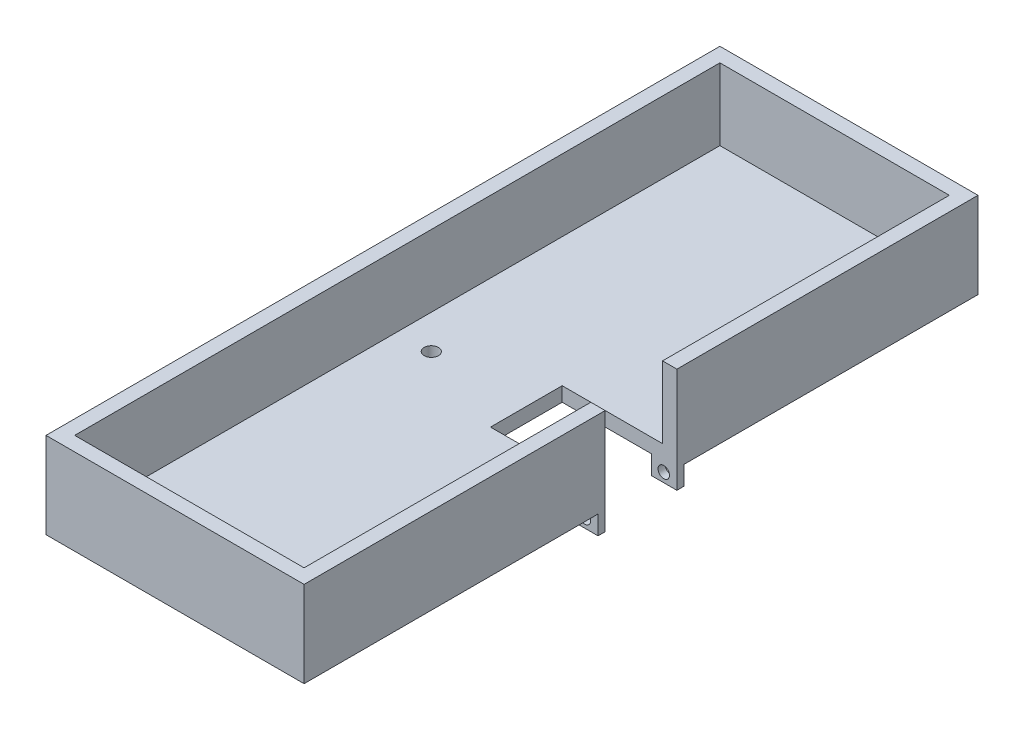
ISO-10303-21;
HEADER;
FILE_DESCRIPTION(('STEP AP214'),'2;1');
FILE_NAME('part.step','',(''),(''),'','','');
FILE_SCHEMA(('AUTOMOTIVE_DESIGN { 1 0 10303 214 1 1 1 1 }'));
ENDSEC;
DATA;
#1=APPLICATION_CONTEXT('core data for automotive mechanical design processes');
#2=APPLICATION_PROTOCOL_DEFINITION('international standard','automotive_design',2000,#1);
#3=PRODUCT_CONTEXT('',#1,'mechanical');
#4=PRODUCT('Part','Part','',(#3));
#5=PRODUCT_RELATED_PRODUCT_CATEGORY('part','',(#4));
#6=PRODUCT_DEFINITION_FORMATION('','',#4);
#7=PRODUCT_DEFINITION_CONTEXT('part definition',#1,'design');
#8=PRODUCT_DEFINITION('design','',#6,#7);
#9=PRODUCT_DEFINITION_SHAPE('','',#8);
#10=(LENGTH_UNIT() NAMED_UNIT(*) SI_UNIT(.MILLI.,.METRE.));
#11=(NAMED_UNIT(*) PLANE_ANGLE_UNIT() SI_UNIT($,.RADIAN.));
#12=(NAMED_UNIT(*) SI_UNIT($,.STERADIAN.) SOLID_ANGLE_UNIT());
#13=UNCERTAINTY_MEASURE_WITH_UNIT(LENGTH_MEASURE(1.E-05),#10,'distance_accuracy_value','');
#14=(GEOMETRIC_REPRESENTATION_CONTEXT(3) GLOBAL_UNCERTAINTY_ASSIGNED_CONTEXT((#13)) GLOBAL_UNIT_ASSIGNED_CONTEXT((#10,
#11,#12)) REPRESENTATION_CONTEXT('',''));
#15=CARTESIAN_POINT('',(0.,0.,0.));
#16=DIRECTION('',(0.,0.,1.));
#17=DIRECTION('',(1.,0.,0.));
#18=AXIS2_PLACEMENT_3D('',#15,#16,#17);
#19=CARTESIAN_POINT('',(0.,-60.,470.));
#20=DIRECTION('',(0.,1.,0.));
#21=DIRECTION('',(0.,0.,1.));
#22=AXIS2_PLACEMENT_3D('',#19,#20,#21);
#23=PLANE('',#22);
#24=CARTESIAN_POINT('',(33.75,-60.,235.));
#25=DIRECTION('',(0.,1.,0.));
#26=DIRECTION('',(0.,0.,1.));
#27=AXIS2_PLACEMENT_3D('',#24,#25,#26);
#28=CIRCLE('',#27,5.00000000000001);
#29=CARTESIAN_POINT('',(33.75,-60.,240.));
#30=VERTEX_POINT('',#29);
#31=EDGE_CURVE('E335',#30,#30,#28,.T.);
#32=ORIENTED_EDGE('',*,*,#31,.T.);
#33=EDGE_LOOP('',(#32));
#34=FACE_BOUND('',#33,.T.);
#35=DIRECTION('',(-1.,0.,0.));
#36=VECTOR('',#35,1.);
#37=CARTESIAN_POINT('',(162.3437837944,-60.,265.));
#38=LINE('',#37,#36);
#39=CARTESIAN_POINT('',(180.,-60.,265.));
#40=VERTEX_POINT('',#39);
#41=CARTESIAN_POINT('',(162.3437837944,-60.,265.));
#42=VERTEX_POINT('',#41);
#43=EDGE_CURVE('E56',#40,#42,#38,.T.);
#44=ORIENTED_EDGE('',*,*,#43,.F.);
#45=DIRECTION('',(0.,0.,-1.));
#46=VECTOR('',#45,1.);
#47=CARTESIAN_POINT('',(180.,-60.,470.));
#48=LINE('',#47,#46);
#49=CARTESIAN_POINT('',(180.,-60.,470.));
#50=VERTEX_POINT('',#49);
#51=EDGE_CURVE('E195',#50,#40,#48,.T.);
#52=ORIENTED_EDGE('',*,*,#51,.F.);
#53=DIRECTION('',(1.,0.,0.));
#54=VECTOR('',#53,1.);
#55=CARTESIAN_POINT('',(0.,-60.,470.));
#56=LINE('',#55,#54);
#57=CARTESIAN_POINT('',(0.,-60.,470.));
#58=VERTEX_POINT('',#57);
#59=EDGE_CURVE('E279',#58,#50,#56,.T.);
#60=ORIENTED_EDGE('',*,*,#59,.F.);
#61=DIRECTION('',(0.,0.,-1.));
#62=VECTOR('',#61,1.);
#63=CARTESIAN_POINT('',(0.,-60.,470.));
#64=LINE('',#63,#62);
#65=CARTESIAN_POINT('',(0.,-60.,0.));
#66=VERTEX_POINT('',#65);
#67=EDGE_CURVE('E283',#58,#66,#64,.T.);
#68=ORIENTED_EDGE('',*,*,#67,.T.);
#69=DIRECTION('',(1.,0.,0.));
#70=VECTOR('',#69,1.);
#71=CARTESIAN_POINT('',(0.,-60.,0.));
#72=LINE('',#71,#70);
#73=CARTESIAN_POINT('',(180.,-60.,0.));
#74=VERTEX_POINT('',#73);
#75=EDGE_CURVE('E284',#66,#74,#72,.T.);
#76=ORIENTED_EDGE('',*,*,#75,.T.);
#77=CARTESIAN_POINT('',(180.,-60.,205.));
#78=VERTEX_POINT('',#77);
#79=EDGE_CURVE('E277',#78,#74,#48,.T.);
#80=ORIENTED_EDGE('',*,*,#79,.F.);
#81=DIRECTION('',(-1.,0.,0.));
#82=VECTOR('',#81,1.);
#83=CARTESIAN_POINT('',(162.3437837944,-60.,205.));
#84=LINE('',#83,#82);
#85=CARTESIAN_POINT('',(162.3437837944,-60.,205.));
#86=VERTEX_POINT('',#85);
#87=EDGE_CURVE('E237',#78,#86,#84,.T.);
#88=ORIENTED_EDGE('',*,*,#87,.T.);
#89=DIRECTION('',(0.,0.,1.));
#90=VECTOR('',#89,1.);
#91=CARTESIAN_POINT('',(162.3437837944,-60.,205.));
#92=LINE('',#91,#90);
#93=CARTESIAN_POINT('',(162.3437837944,-60.,210.));
#94=VERTEX_POINT('',#93);
#95=EDGE_CURVE('E229',#86,#94,#92,.T.);
#96=ORIENTED_EDGE('',*,*,#95,.T.);
#97=DIRECTION('',(1.,0.,0.));
#98=VECTOR('',#97,1.);
#99=CARTESIAN_POINT('',(0.,-60.,210.));
#100=LINE('',#99,#98);
#101=CARTESIAN_POINT('',(100.,-60.,210.));
#102=VERTEX_POINT('',#101);
#103=EDGE_CURVE('E268',#102,#94,#100,.T.);
#104=ORIENTED_EDGE('',*,*,#103,.F.);
#105=DIRECTION('',(0.,0.,1.));
#106=VECTOR('',#105,1.);
#107=CARTESIAN_POINT('',(100.,-60.,470.));
#108=LINE('',#107,#106);
#109=CARTESIAN_POINT('',(100.,-60.,260.));
#110=VERTEX_POINT('',#109);
#111=EDGE_CURVE('E11',#102,#110,#108,.T.);
#112=ORIENTED_EDGE('',*,*,#111,.T.);
#113=DIRECTION('',(1.,0.,0.));
#114=VECTOR('',#113,1.);
#115=CARTESIAN_POINT('',(0.,-60.,260.));
#116=LINE('',#115,#114);
#117=CARTESIAN_POINT('',(162.3437837944,-60.,260.));
#118=VERTEX_POINT('',#117);
#119=EDGE_CURVE('E260',#110,#118,#116,.T.);
#120=ORIENTED_EDGE('',*,*,#119,.T.);
#121=DIRECTION('',(0.,0.,-1.));
#122=VECTOR('',#121,1.);
#123=CARTESIAN_POINT('',(162.3437837944,-60.,265.));
#124=LINE('',#123,#122);
#125=EDGE_CURVE('E52',#42,#118,#124,.T.);
#126=ORIENTED_EDGE('',*,*,#125,.F.);
#127=EDGE_LOOP('',(#44,#52,#60,#68,#76,#80,#88,#96,#104,#112,#120,#126));
#128=FACE_BOUND('',#127,.T.);
#129=ADVANCED_FACE('F35',(#34,#128),#23,.F.);
#130=CARTESIAN_POINT('',(0.,-50.,470.));
#131=DIRECTION('',(0.,1.,0.));
#132=DIRECTION('',(0.,0.,1.));
#133=AXIS2_PLACEMENT_3D('',#130,#131,#132);
#134=PLANE('',#133);
#135=CARTESIAN_POINT('',(33.75,-50.,235.));
#136=DIRECTION('',(0.,1.,0.));
#137=DIRECTION('',(0.,0.,1.));
#138=AXIS2_PLACEMENT_3D('',#135,#136,#137);
#139=CIRCLE('',#138,5.00000000000001);
#140=CARTESIAN_POINT('',(33.75,-50.,240.));
#141=VERTEX_POINT('',#140);
#142=EDGE_CURVE('E339',#141,#141,#139,.T.);
#143=ORIENTED_EDGE('',*,*,#142,.F.);
#144=EDGE_LOOP('',(#143));
#145=FACE_BOUND('',#144,.T.);
#146=DIRECTION('',(0.,0.,1.));
#147=VECTOR('',#146,1.);
#148=CARTESIAN_POINT('',(100.,-50.,470.));
#149=LINE('',#148,#147);
#150=CARTESIAN_POINT('',(100.,-50.,210.));
#151=VERTEX_POINT('',#150);
#152=CARTESIAN_POINT('',(100.,-50.,260.));
#153=VERTEX_POINT('',#152);
#154=EDGE_CURVE('E271',#151,#153,#149,.T.);
#155=ORIENTED_EDGE('',*,*,#154,.F.);
#156=DIRECTION('',(1.,0.,0.));
#157=VECTOR('',#156,1.);
#158=CARTESIAN_POINT('',(0.,-50.,210.));
#159=LINE('',#158,#157);
#160=CARTESIAN_POINT('',(170.,-50.,210.));
#161=VERTEX_POINT('',#160);
#162=EDGE_CURVE('E265',#151,#161,#159,.T.);
#163=ORIENTED_EDGE('',*,*,#162,.T.);
#164=DIRECTION('',(0.,0.,-1.));
#165=VECTOR('',#164,1.);
#166=CARTESIAN_POINT('',(170.,-50.,0.));
#167=LINE('',#166,#165);
#168=CARTESIAN_POINT('',(170.,-50.,10.));
#169=VERTEX_POINT('',#168);
#170=EDGE_CURVE('E305',#161,#169,#167,.T.);
#171=ORIENTED_EDGE('',*,*,#170,.T.);
#172=DIRECTION('',(1.,0.,0.));
#173=VECTOR('',#172,1.);
#174=CARTESIAN_POINT('',(0.,-50.,10.));
#175=LINE('',#174,#173);
#176=CARTESIAN_POINT('',(10.,-50.,10.));
#177=VERTEX_POINT('',#176);
#178=EDGE_CURVE('E313',#177,#169,#175,.T.);
#179=ORIENTED_EDGE('',*,*,#178,.F.);
#180=DIRECTION('',(0.,0.,-1.));
#181=VECTOR('',#180,1.);
#182=CARTESIAN_POINT('',(10.,-50.,470.));
#183=LINE('',#182,#181);
#184=CARTESIAN_POINT('',(10.,-50.,460.));
#185=VERTEX_POINT('',#184);
#186=EDGE_CURVE('E293',#185,#177,#183,.T.);
#187=ORIENTED_EDGE('',*,*,#186,.F.);
#188=DIRECTION('',(1.,0.,0.));
#189=VECTOR('',#188,1.);
#190=CARTESIAN_POINT('',(0.,-50.,460.));
#191=LINE('',#190,#189);
#192=CARTESIAN_POINT('',(170.,-50.,460.));
#193=VERTEX_POINT('',#192);
#194=EDGE_CURVE('E334',#185,#193,#191,.T.);
#195=ORIENTED_EDGE('',*,*,#194,.T.);
#196=CARTESIAN_POINT('',(170.,-50.,260.));
#197=VERTEX_POINT('',#196);
#198=EDGE_CURVE('E326',#193,#197,#167,.T.);
#199=ORIENTED_EDGE('',*,*,#198,.T.);
#200=DIRECTION('',(1.,0.,0.));
#201=VECTOR('',#200,1.);
#202=CARTESIAN_POINT('',(0.,-50.,260.));
#203=LINE('',#202,#201);
#204=EDGE_CURVE('E258',#153,#197,#203,.T.);
#205=ORIENTED_EDGE('',*,*,#204,.F.);
#206=EDGE_LOOP('',(#155,#163,#171,#179,#187,#195,#199,#205));
#207=FACE_BOUND('',#206,.T.);
#208=ADVANCED_FACE('F384',(#145,#207),#134,.T.);
#209=CARTESIAN_POINT('',(180.,0.,470.));
#210=DIRECTION('',(1.,0.,0.));
#211=DIRECTION('',(0.,0.,-1.));
#212=AXIS2_PLACEMENT_3D('',#209,#210,#211);
#213=PLANE('',#212);
#214=DIRECTION('',(0.,0.,-1.));
#215=VECTOR('',#214,1.);
#216=CARTESIAN_POINT('',(180.,0.,0.));
#217=LINE('',#216,#215);
#218=CARTESIAN_POINT('',(180.,0.,210.));
#219=VERTEX_POINT('',#218);
#220=CARTESIAN_POINT('',(180.,0.,1.11022302462516E-13));
#221=VERTEX_POINT('',#220);
#222=EDGE_CURVE('E325',#219,#221,#217,.T.);
#223=ORIENTED_EDGE('',*,*,#222,.F.);
#224=DIRECTION('',(0.,1.,0.));
#225=VECTOR('',#224,1.);
#226=CARTESIAN_POINT('',(180.,-130.,210.));
#227=LINE('',#226,#225);
#228=CARTESIAN_POINT('',(180.,-73.2020940686233,210.));
#229=VERTEX_POINT('',#228);
#230=EDGE_CURVE('E247',#229,#219,#227,.T.);
#231=ORIENTED_EDGE('',*,*,#230,.F.);
#232=DIRECTION('',(0.,0.,1.));
#233=VECTOR('',#232,1.);
#234=CARTESIAN_POINT('',(180.,-73.2020940686233,205.));
#235=LINE('',#234,#233);
#236=CARTESIAN_POINT('',(180.,-73.2020940686233,205.));
#237=VERTEX_POINT('',#236);
#238=EDGE_CURVE('E226',#237,#229,#235,.T.);
#239=ORIENTED_EDGE('',*,*,#238,.F.);
#240=DIRECTION('',(0.,1.,0.));
#241=VECTOR('',#240,1.);
#242=CARTESIAN_POINT('',(180.,-60.,205.));
#243=LINE('',#242,#241);
#244=EDGE_CURVE('E221',#237,#78,#243,.T.);
#245=ORIENTED_EDGE('',*,*,#244,.T.);
#246=ORIENTED_EDGE('',*,*,#79,.T.);
#247=DIRECTION('',(0.,-1.,0.));
#248=VECTOR('',#247,1.);
#249=CARTESIAN_POINT('',(180.,0.,0.));
#250=LINE('',#249,#248);
#251=EDGE_CURVE('E338',#221,#74,#250,.T.);
#252=ORIENTED_EDGE('',*,*,#251,.F.);
#253=EDGE_LOOP('',(#223,#231,#239,#245,#246,#252));
#254=FACE_BOUND('',#253,.T.);
#255=ADVANCED_FACE('F366',(#254),#213,.T.);
#256=CARTESIAN_POINT('',(0.,0.,470.));
#257=DIRECTION('',(0.,1.,0.));
#258=DIRECTION('',(0.,0.,1.));
#259=AXIS2_PLACEMENT_3D('',#256,#257,#258);
#260=PLANE('',#259);
#261=DIRECTION('',(0.,0.,-1.));
#262=VECTOR('',#261,1.);
#263=CARTESIAN_POINT('',(170.,0.,0.));
#264=LINE('',#263,#262);
#265=CARTESIAN_POINT('',(170.,0.,210.));
#266=VERTEX_POINT('',#265);
#267=CARTESIAN_POINT('',(170.,0.,10.));
#268=VERTEX_POINT('',#267);
#269=EDGE_CURVE('E303',#266,#268,#264,.T.);
#270=ORIENTED_EDGE('',*,*,#269,.F.);
#271=DIRECTION('',(1.,0.,0.));
#272=VECTOR('',#271,1.);
#273=CARTESIAN_POINT('',(0.,0.,210.));
#274=LINE('',#273,#272);
#275=EDGE_CURVE('E262',#266,#219,#274,.T.);
#276=ORIENTED_EDGE('',*,*,#275,.T.);
#277=ORIENTED_EDGE('',*,*,#222,.T.);
#278=DIRECTION('',(1.,0.,0.));
#279=VECTOR('',#278,1.);
#280=CARTESIAN_POINT('',(0.,0.,0.));
#281=LINE('',#280,#279);
#282=CARTESIAN_POINT('',(0.,0.,0.));
#283=VERTEX_POINT('',#282);
#284=EDGE_CURVE('E352',#283,#221,#281,.T.);
#285=ORIENTED_EDGE('',*,*,#284,.F.);
#286=DIRECTION('',(0.,0.,-1.));
#287=VECTOR('',#286,1.);
#288=CARTESIAN_POINT('',(0.,0.,470.));
#289=LINE('',#288,#287);
#290=CARTESIAN_POINT('',(0.,0.,470.));
#291=VERTEX_POINT('',#290);
#292=EDGE_CURVE('E288',#291,#283,#289,.T.);
#293=ORIENTED_EDGE('',*,*,#292,.F.);
#294=DIRECTION('',(1.,0.,0.));
#295=VECTOR('',#294,1.);
#296=CARTESIAN_POINT('',(0.,0.,470.));
#297=LINE('',#296,#295);
#298=CARTESIAN_POINT('',(180.,0.,470.));
#299=VERTEX_POINT('',#298);
#300=EDGE_CURVE('E345',#291,#299,#297,.T.);
#301=ORIENTED_EDGE('',*,*,#300,.T.);
#302=CARTESIAN_POINT('',(180.,0.,260.));
#303=VERTEX_POINT('',#302);
#304=EDGE_CURVE('E342',#299,#303,#217,.T.);
#305=ORIENTED_EDGE('',*,*,#304,.T.);
#306=DIRECTION('',(1.,0.,0.));
#307=VECTOR('',#306,1.);
#308=CARTESIAN_POINT('',(0.,0.,260.));
#309=LINE('',#308,#307);
#310=CARTESIAN_POINT('',(170.,0.,260.));
#311=VERTEX_POINT('',#310);
#312=EDGE_CURVE('E249',#311,#303,#309,.T.);
#313=ORIENTED_EDGE('',*,*,#312,.F.);
#314=CARTESIAN_POINT('',(170.,0.,460.));
#315=VERTEX_POINT('',#314);
#316=EDGE_CURVE('E312',#315,#311,#264,.T.);
#317=ORIENTED_EDGE('',*,*,#316,.F.);
#318=DIRECTION('',(1.,0.,0.));
#319=VECTOR('',#318,1.);
#320=CARTESIAN_POINT('',(0.,0.,460.));
#321=LINE('',#320,#319);
#322=CARTESIAN_POINT('',(10.,0.,460.));
#323=VERTEX_POINT('',#322);
#324=EDGE_CURVE('E322',#323,#315,#321,.T.);
#325=ORIENTED_EDGE('',*,*,#324,.F.);
#326=DIRECTION('',(0.,0.,-1.));
#327=VECTOR('',#326,1.);
#328=CARTESIAN_POINT('',(10.,0.,470.));
#329=LINE('',#328,#327);
#330=CARTESIAN_POINT('',(10.,0.,10.));
#331=VERTEX_POINT('',#330);
#332=EDGE_CURVE('E290',#323,#331,#329,.T.);
#333=ORIENTED_EDGE('',*,*,#332,.T.);
#334=DIRECTION('',(1.,0.,0.));
#335=VECTOR('',#334,1.);
#336=CARTESIAN_POINT('',(0.,0.,10.));
#337=LINE('',#336,#335);
#338=EDGE_CURVE('E311',#331,#268,#337,.T.);
#339=ORIENTED_EDGE('',*,*,#338,.T.);
#340=EDGE_LOOP('',(#270,#276,#277,#285,#293,#301,#305,#313,#317,#325,#333,#339));
#341=FACE_BOUND('',#340,.T.);
#342=ADVANCED_FACE('F309',(#341),#260,.T.);
#343=CARTESIAN_POINT('',(170.,499.799959983992,0.));
#344=DIRECTION('',(-1.,0.,0.));
#345=DIRECTION('',(0.,0.,1.));
#346=AXIS2_PLACEMENT_3D('',#343,#344,#345);
#347=PLANE('',#346);
#348=ORIENTED_EDGE('',*,*,#170,.F.);
#349=DIRECTION('',(0.,1.,0.));
#350=VECTOR('',#349,1.);
#351=CARTESIAN_POINT('',(170.,499.799959983992,210.));
#352=LINE('',#351,#350);
#353=EDGE_CURVE('E44',#161,#266,#352,.T.);
#354=ORIENTED_EDGE('',*,*,#353,.T.);
#355=ORIENTED_EDGE('',*,*,#269,.T.);
#356=DIRECTION('',(0.,-1.,0.));
#357=VECTOR('',#356,1.);
#358=CARTESIAN_POINT('',(170.,499.799959983992,10.));
#359=LINE('',#358,#357);
#360=EDGE_CURVE('E316',#268,#169,#359,.T.);
#361=ORIENTED_EDGE('',*,*,#360,.T.);
#362=EDGE_LOOP('',(#348,#354,#355,#361));
#363=FACE_BOUND('',#362,.T.);
#364=ADVANCED_FACE('F301',(#363),#347,.T.);
#365=CARTESIAN_POINT('',(10.,0.,470.));
#366=DIRECTION('',(1.,0.,0.));
#367=DIRECTION('',(0.,0.,-1.));
#368=AXIS2_PLACEMENT_3D('',#365,#366,#367);
#369=PLANE('',#368);
#370=ORIENTED_EDGE('',*,*,#186,.T.);
#371=DIRECTION('',(0.,-1.,0.));
#372=VECTOR('',#371,1.);
#373=CARTESIAN_POINT('',(10.,499.799959983992,10.));
#374=LINE('',#373,#372);
#375=EDGE_CURVE('E318',#331,#177,#374,.T.);
#376=ORIENTED_EDGE('',*,*,#375,.F.);
#377=ORIENTED_EDGE('',*,*,#332,.F.);
#378=DIRECTION('',(0.,-1.,0.));
#379=VECTOR('',#378,1.);
#380=CARTESIAN_POINT('',(10.,499.799959983992,460.));
#381=LINE('',#380,#379);
#382=EDGE_CURVE('E331',#323,#185,#381,.T.);
#383=ORIENTED_EDGE('',*,*,#382,.T.);
#384=EDGE_LOOP('',(#370,#376,#377,#383));
#385=FACE_BOUND('',#384,.T.);
#386=ADVANCED_FACE('F409',(#385),#369,.T.);
#387=DIRECTION('',(0.,1.,0.));
#388=VECTOR('',#387,1.);
#389=CARTESIAN_POINT('',(180.,-130.,260.));
#390=LINE('',#389,#388);
#391=CARTESIAN_POINT('',(180.,-73.2020940686233,260.));
#392=VERTEX_POINT('',#391);
#393=EDGE_CURVE('E250',#392,#303,#390,.T.);
#394=ORIENTED_EDGE('',*,*,#393,.T.);
#395=ORIENTED_EDGE('',*,*,#304,.F.);
#396=DIRECTION('',(0.,-1.,0.));
#397=VECTOR('',#396,1.);
#398=CARTESIAN_POINT('',(180.,0.,470.));
#399=LINE('',#398,#397);
#400=EDGE_CURVE('E343',#299,#50,#399,.T.);
#401=ORIENTED_EDGE('',*,*,#400,.T.);
#402=ORIENTED_EDGE('',*,*,#51,.T.);
#403=DIRECTION('',(0.,1.,0.));
#404=VECTOR('',#403,1.);
#405=CARTESIAN_POINT('',(180.,-60.,265.));
#406=LINE('',#405,#404);
#407=CARTESIAN_POINT('',(180.,-73.2020940686233,265.));
#408=VERTEX_POINT('',#407);
#409=EDGE_CURVE('E178',#408,#40,#406,.T.);
#410=ORIENTED_EDGE('',*,*,#409,.F.);
#411=DIRECTION('',(0.,0.,-1.));
#412=VECTOR('',#411,1.);
#413=CARTESIAN_POINT('',(180.,-73.2020940686233,265.));
#414=LINE('',#413,#412);
#415=EDGE_CURVE('E187',#408,#392,#414,.T.);
#416=ORIENTED_EDGE('',*,*,#415,.T.);
#417=EDGE_LOOP('',(#394,#395,#401,#402,#410,#416));
#418=FACE_BOUND('',#417,.T.);
#419=ADVANCED_FACE('F37',(#418),#213,.T.);
#420=CARTESIAN_POINT('',(0.,0.,470.));
#421=DIRECTION('',(1.,0.,0.));
#422=DIRECTION('',(0.,1.,0.));
#423=AXIS2_PLACEMENT_3D('',#420,#421,#422);
#424=PLANE('',#423);
#425=DIRECTION('',(0.,-1.,0.));
#426=VECTOR('',#425,1.);
#427=CARTESIAN_POINT('',(0.,0.,0.));
#428=LINE('',#427,#426);
#429=EDGE_CURVE('E354',#283,#66,#428,.T.);
#430=ORIENTED_EDGE('',*,*,#429,.T.);
#431=ORIENTED_EDGE('',*,*,#67,.F.);
#432=DIRECTION('',(0.,-1.,0.));
#433=VECTOR('',#432,1.);
#434=CARTESIAN_POINT('',(0.,0.,470.));
#435=LINE('',#434,#433);
#436=EDGE_CURVE('E347',#291,#58,#435,.T.);
#437=ORIENTED_EDGE('',*,*,#436,.F.);
#438=ORIENTED_EDGE('',*,*,#292,.T.);
#439=EDGE_LOOP('',(#430,#431,#437,#438));
#440=FACE_BOUND('',#439,.T.);
#441=ADVANCED_FACE('F435',(#440),#424,.F.);
#442=CARTESIAN_POINT('',(0.,0.,470.));
#443=DIRECTION('',(0.,0.,1.));
#444=DIRECTION('',(1.,0.,0.));
#445=AXIS2_PLACEMENT_3D('',#442,#443,#444);
#446=PLANE('',#445);
#447=ORIENTED_EDGE('',*,*,#400,.F.);
#448=ORIENTED_EDGE('',*,*,#300,.F.);
#449=ORIENTED_EDGE('',*,*,#436,.T.);
#450=ORIENTED_EDGE('',*,*,#59,.T.);
#451=EDGE_LOOP('',(#447,#448,#449,#450));
#452=FACE_BOUND('',#451,.T.);
#453=ADVANCED_FACE('F438',(#452),#446,.T.);
#454=CARTESIAN_POINT('',(0.,0.,0.));
#455=DIRECTION('',(0.,0.,1.));
#456=DIRECTION('',(1.,0.,0.));
#457=AXIS2_PLACEMENT_3D('',#454,#455,#456);
#458=PLANE('',#457);
#459=ORIENTED_EDGE('',*,*,#251,.T.);
#460=ORIENTED_EDGE('',*,*,#75,.F.);
#461=ORIENTED_EDGE('',*,*,#429,.F.);
#462=ORIENTED_EDGE('',*,*,#284,.T.);
#463=EDGE_LOOP('',(#459,#460,#461,#462));
#464=FACE_BOUND('',#463,.T.);
#465=ADVANCED_FACE('F363',(#464),#458,.F.);
#466=CARTESIAN_POINT('',(33.75,-60.,235.));
#467=DIRECTION('',(0.,1.,0.));
#468=DIRECTION('',(0.,0.,1.));
#469=AXIS2_PLACEMENT_3D('',#466,#467,#468);
#470=CYLINDRICAL_SURFACE('',#469,5.00000000000001);
#471=ORIENTED_EDGE('',*,*,#31,.F.);
#472=EDGE_LOOP('',(#471));
#473=FACE_BOUND('',#472,.T.);
#474=ORIENTED_EDGE('',*,*,#142,.T.);
#475=EDGE_LOOP('',(#474));
#476=FACE_BOUND('',#475,.T.);
#477=ADVANCED_FACE('F452',(#473,#476),#470,.F.);
#478=CARTESIAN_POINT('',(0.,499.799959983992,10.));
#479=DIRECTION('',(0.,0.,-1.));
#480=DIRECTION('',(-1.,0.,0.));
#481=AXIS2_PLACEMENT_3D('',#478,#479,#480);
#482=PLANE('',#481);
#483=ORIENTED_EDGE('',*,*,#338,.F.);
#484=ORIENTED_EDGE('',*,*,#375,.T.);
#485=ORIENTED_EDGE('',*,*,#178,.T.);
#486=ORIENTED_EDGE('',*,*,#360,.F.);
#487=EDGE_LOOP('',(#483,#484,#485,#486));
#488=FACE_BOUND('',#487,.T.);
#489=ADVANCED_FACE('F406',(#488),#482,.F.);
#490=DIRECTION('',(0.,1.,0.));
#491=VECTOR('',#490,1.);
#492=CARTESIAN_POINT('',(170.,499.799959983992,260.));
#493=LINE('',#492,#491);
#494=EDGE_CURVE('E296',#197,#311,#493,.T.);
#495=ORIENTED_EDGE('',*,*,#494,.F.);
#496=ORIENTED_EDGE('',*,*,#198,.F.);
#497=DIRECTION('',(0.,-1.,0.));
#498=VECTOR('',#497,1.);
#499=CARTESIAN_POINT('',(170.,499.799959983992,460.));
#500=LINE('',#499,#498);
#501=EDGE_CURVE('E329',#315,#193,#500,.T.);
#502=ORIENTED_EDGE('',*,*,#501,.F.);
#503=ORIENTED_EDGE('',*,*,#316,.T.);
#504=EDGE_LOOP('',(#495,#496,#502,#503));
#505=FACE_BOUND('',#504,.T.);
#506=ADVANCED_FACE('F394',(#505),#347,.T.);
#507=CARTESIAN_POINT('',(0.,499.799959983992,460.));
#508=DIRECTION('',(0.,0.,-1.));
#509=DIRECTION('',(-1.,0.,0.));
#510=AXIS2_PLACEMENT_3D('',#507,#508,#509);
#511=PLANE('',#510);
#512=ORIENTED_EDGE('',*,*,#382,.F.);
#513=ORIENTED_EDGE('',*,*,#324,.T.);
#514=ORIENTED_EDGE('',*,*,#501,.T.);
#515=ORIENTED_EDGE('',*,*,#194,.F.);
#516=EDGE_LOOP('',(#512,#513,#514,#515));
#517=FACE_BOUND('',#516,.T.);
#518=ADVANCED_FACE('F411',(#517),#511,.T.);
#519=CARTESIAN_POINT('',(100.,-130.,0.));
#520=DIRECTION('',(-1.,0.,0.));
#521=DIRECTION('',(0.,0.,1.));
#522=AXIS2_PLACEMENT_3D('',#519,#520,#521);
#523=PLANE('',#522);
#524=ORIENTED_EDGE('',*,*,#154,.T.);
#525=DIRECTION('',(0.,1.,0.));
#526=VECTOR('',#525,1.);
#527=CARTESIAN_POINT('',(100.,-130.,260.));
#528=LINE('',#527,#526);
#529=EDGE_CURVE('E252',#110,#153,#528,.T.);
#530=ORIENTED_EDGE('',*,*,#529,.F.);
#531=ORIENTED_EDGE('',*,*,#111,.F.);
#532=DIRECTION('',(0.,1.,0.));
#533=VECTOR('',#532,1.);
#534=CARTESIAN_POINT('',(100.,-130.,210.));
#535=LINE('',#534,#533);
#536=EDGE_CURVE('E233',#102,#151,#535,.T.);
#537=ORIENTED_EDGE('',*,*,#536,.T.);
#538=EDGE_LOOP('',(#524,#530,#531,#537));
#539=FACE_BOUND('',#538,.T.);
#540=ADVANCED_FACE('F380',(#539),#523,.F.);
#541=CARTESIAN_POINT('',(0.,-130.,210.));
#542=DIRECTION('',(0.,0.,1.));
#543=DIRECTION('',(1.,0.,0.));
#544=AXIS2_PLACEMENT_3D('',#541,#542,#543);
#545=PLANE('',#544);
#546=ORIENTED_EDGE('',*,*,#103,.T.);
#547=DIRECTION('',(0.,-1.,0.));
#548=VECTOR('',#547,1.);
#549=CARTESIAN_POINT('',(162.3437837944,-60.,210.));
#550=LINE('',#549,#548);
#551=CARTESIAN_POINT('',(162.3437837944,-73.2020940686233,210.));
#552=VERTEX_POINT('',#551);
#553=EDGE_CURVE('E211',#94,#552,#550,.T.);
#554=ORIENTED_EDGE('',*,*,#553,.T.);
#555=DIRECTION('',(1.,0.,0.));
#556=VECTOR('',#555,1.);
#557=CARTESIAN_POINT('',(162.3437837944,-73.2020940686233,210.));
#558=LINE('',#557,#556);
#559=EDGE_CURVE('E218',#552,#229,#558,.T.);
#560=ORIENTED_EDGE('',*,*,#559,.T.);
#561=ORIENTED_EDGE('',*,*,#230,.T.);
#562=ORIENTED_EDGE('',*,*,#275,.F.);
#563=ORIENTED_EDGE('',*,*,#353,.F.);
#564=ORIENTED_EDGE('',*,*,#162,.F.);
#565=ORIENTED_EDGE('',*,*,#536,.F.);
#566=EDGE_LOOP('',(#546,#554,#560,#561,#562,#563,#564,#565));
#567=FACE_BOUND('',#566,.T.);
#568=CARTESIAN_POINT('',(170.838161539339,-66.7449177629221,210.));
#569=DIRECTION('',(0.,0.,1.));
#570=DIRECTION('',(1.,0.,0.));
#571=AXIS2_PLACEMENT_3D('',#568,#569,#570);
#572=CIRCLE('',#571,3.99999999999999);
#573=CARTESIAN_POINT('',(174.838161539339,-66.7449177629221,210.));
#574=VERTEX_POINT('',#573);
#575=EDGE_CURVE('E205',#574,#574,#572,.T.);
#576=ORIENTED_EDGE('',*,*,#575,.F.);
#577=EDGE_LOOP('',(#576));
#578=FACE_BOUND('',#577,.T.);
#579=ADVANCED_FACE('F376',(#567,#578),#545,.T.);
#580=CARTESIAN_POINT('',(0.,-130.,260.));
#581=DIRECTION('',(0.,0.,1.));
#582=DIRECTION('',(1.,0.,0.));
#583=AXIS2_PLACEMENT_3D('',#580,#581,#582);
#584=PLANE('',#583);
#585=ORIENTED_EDGE('',*,*,#529,.T.);
#586=ORIENTED_EDGE('',*,*,#204,.T.);
#587=ORIENTED_EDGE('',*,*,#494,.T.);
#588=ORIENTED_EDGE('',*,*,#312,.T.);
#589=ORIENTED_EDGE('',*,*,#393,.F.);
#590=DIRECTION('',(1.,0.,0.));
#591=VECTOR('',#590,1.);
#592=CARTESIAN_POINT('',(162.3437837944,-73.2020940686233,260.));
#593=LINE('',#592,#591);
#594=CARTESIAN_POINT('',(162.3437837944,-73.2020940686233,260.));
#595=VERTEX_POINT('',#594);
#596=EDGE_CURVE('E189',#595,#392,#593,.T.);
#597=ORIENTED_EDGE('',*,*,#596,.F.);
#598=DIRECTION('',(0.,-1.,0.));
#599=VECTOR('',#598,1.);
#600=CARTESIAN_POINT('',(162.3437837944,-60.,260.));
#601=LINE('',#600,#599);
#602=EDGE_CURVE('E200',#118,#595,#601,.T.);
#603=ORIENTED_EDGE('',*,*,#602,.F.);
#604=ORIENTED_EDGE('',*,*,#119,.F.);
#605=EDGE_LOOP('',(#585,#586,#587,#588,#589,#597,#603,#604));
#606=FACE_BOUND('',#605,.T.);
#607=CARTESIAN_POINT('',(170.838161539339,-66.7449177629221,260.));
#608=DIRECTION('',(0.,0.,1.));
#609=DIRECTION('',(1.,0.,0.));
#610=AXIS2_PLACEMENT_3D('',#607,#608,#609);
#611=CIRCLE('',#610,3.99999999999999);
#612=CARTESIAN_POINT('',(174.838161539339,-66.7449177629221,260.));
#613=VERTEX_POINT('',#612);
#614=EDGE_CURVE('E691',#613,#613,#611,.T.);
#615=ORIENTED_EDGE('',*,*,#614,.T.);
#616=EDGE_LOOP('',(#615));
#617=FACE_BOUND('',#616,.T.);
#618=ADVANCED_FACE('F390',(#606,#617),#584,.F.);
#619=CARTESIAN_POINT('',(162.3437837944,-60.,205.));
#620=DIRECTION('',(-1.,0.,0.));
#621=DIRECTION('',(0.,0.,1.));
#622=AXIS2_PLACEMENT_3D('',#619,#620,#621);
#623=PLANE('',#622);
#624=ORIENTED_EDGE('',*,*,#553,.F.);
#625=ORIENTED_EDGE('',*,*,#95,.F.);
#626=DIRECTION('',(0.,-1.,0.));
#627=VECTOR('',#626,1.);
#628=CARTESIAN_POINT('',(162.3437837944,-60.,205.));
#629=LINE('',#628,#627);
#630=CARTESIAN_POINT('',(162.3437837944,-73.2020940686233,205.));
#631=VERTEX_POINT('',#630);
#632=EDGE_CURVE('E214',#86,#631,#629,.T.);
#633=ORIENTED_EDGE('',*,*,#632,.T.);
#634=DIRECTION('',(0.,0.,1.));
#635=VECTOR('',#634,1.);
#636=CARTESIAN_POINT('',(162.3437837944,-73.2020940686233,205.));
#637=LINE('',#636,#635);
#638=EDGE_CURVE('E240',#631,#552,#637,.T.);
#639=ORIENTED_EDGE('',*,*,#638,.T.);
#640=EDGE_LOOP('',(#624,#625,#633,#639));
#641=FACE_BOUND('',#640,.T.);
#642=ADVANCED_FACE('F372',(#641),#623,.T.);
#643=CARTESIAN_POINT('',(162.3437837944,-73.2020940686233,205.));
#644=DIRECTION('',(0.,-1.,0.));
#645=DIRECTION('',(0.,0.,-1.));
#646=AXIS2_PLACEMENT_3D('',#643,#644,#645);
#647=PLANE('',#646);
#648=ORIENTED_EDGE('',*,*,#559,.F.);
#649=ORIENTED_EDGE('',*,*,#638,.F.);
#650=DIRECTION('',(1.,0.,0.));
#651=VECTOR('',#650,1.);
#652=CARTESIAN_POINT('',(162.3437837944,-73.2020940686233,205.));
#653=LINE('',#652,#651);
#654=EDGE_CURVE('E217',#631,#237,#653,.T.);
#655=ORIENTED_EDGE('',*,*,#654,.T.);
#656=ORIENTED_EDGE('',*,*,#238,.T.);
#657=EDGE_LOOP('',(#648,#649,#655,#656));
#658=FACE_BOUND('',#657,.T.);
#659=ADVANCED_FACE('F506',(#658),#647,.T.);
#660=CARTESIAN_POINT('',(0.,0.,205.));
#661=DIRECTION('',(0.,0.,1.));
#662=DIRECTION('',(1.,0.,0.));
#663=AXIS2_PLACEMENT_3D('',#660,#661,#662);
#664=PLANE('',#663);
#665=CARTESIAN_POINT('',(170.838161539339,-66.7449177629221,205.));
#666=DIRECTION('',(0.,0.,1.));
#667=DIRECTION('',(1.,0.,0.));
#668=AXIS2_PLACEMENT_3D('',#665,#666,#667);
#669=CIRCLE('',#668,3.99999999999999);
#670=CARTESIAN_POINT('',(174.838161539339,-66.7449177629221,205.));
#671=VERTEX_POINT('',#670);
#672=EDGE_CURVE('E208',#671,#671,#669,.T.);
#673=ORIENTED_EDGE('',*,*,#672,.T.);
#674=EDGE_LOOP('',(#673));
#675=FACE_BOUND('',#674,.T.);
#676=ORIENTED_EDGE('',*,*,#632,.F.);
#677=ORIENTED_EDGE('',*,*,#87,.F.);
#678=ORIENTED_EDGE('',*,*,#244,.F.);
#679=ORIENTED_EDGE('',*,*,#654,.F.);
#680=EDGE_LOOP('',(#676,#677,#678,#679));
#681=FACE_BOUND('',#680,.T.);
#682=ADVANCED_FACE('F371',(#675,#681),#664,.F.);
#683=CARTESIAN_POINT('',(170.838161539339,-66.7449177629221,205.));
#684=DIRECTION('',(0.,0.,1.));
#685=DIRECTION('',(1.,0.,0.));
#686=AXIS2_PLACEMENT_3D('',#683,#684,#685);
#687=CYLINDRICAL_SURFACE('',#686,3.99999999999999);
#688=ORIENTED_EDGE('',*,*,#672,.F.);
#689=EDGE_LOOP('',(#688));
#690=FACE_BOUND('',#689,.T.);
#691=ORIENTED_EDGE('',*,*,#575,.T.);
#692=EDGE_LOOP('',(#691));
#693=FACE_BOUND('',#692,.T.);
#694=ADVANCED_FACE('F523',(#690,#693),#687,.F.);
#695=CARTESIAN_POINT('',(0.,0.,265.));
#696=DIRECTION('',(0.,0.,-1.));
#697=DIRECTION('',(1.,0.,0.));
#698=AXIS2_PLACEMENT_3D('',#695,#696,#697);
#699=PLANE('',#698);
#700=DIRECTION('',(0.,-1.,0.));
#701=VECTOR('',#700,1.);
#702=CARTESIAN_POINT('',(162.3437837944,-60.,265.));
#703=LINE('',#702,#701);
#704=CARTESIAN_POINT('',(162.3437837944,-73.2020940686233,265.));
#705=VERTEX_POINT('',#704);
#706=EDGE_CURVE('E180',#42,#705,#703,.T.);
#707=ORIENTED_EDGE('',*,*,#706,.T.);
#708=DIRECTION('',(1.,0.,0.));
#709=VECTOR('',#708,1.);
#710=CARTESIAN_POINT('',(162.3437837944,-73.2020940686233,265.));
#711=LINE('',#710,#709);
#712=EDGE_CURVE('E173',#705,#408,#711,.T.);
#713=ORIENTED_EDGE('',*,*,#712,.T.);
#714=ORIENTED_EDGE('',*,*,#409,.T.);
#715=ORIENTED_EDGE('',*,*,#43,.T.);
#716=EDGE_LOOP('',(#707,#713,#714,#715));
#717=FACE_BOUND('',#716,.T.);
#718=CARTESIAN_POINT('',(170.838161539339,-66.7449177629221,265.));
#719=DIRECTION('',(0.,0.,1.));
#720=DIRECTION('',(1.,0.,0.));
#721=AXIS2_PLACEMENT_3D('',#718,#719,#720);
#722=CIRCLE('',#721,3.99999999999999);
#723=CARTESIAN_POINT('',(174.838161539339,-66.7449177629221,265.));
#724=VERTEX_POINT('',#723);
#725=EDGE_CURVE('E203',#724,#724,#722,.T.);
#726=ORIENTED_EDGE('',*,*,#725,.F.);
#727=EDGE_LOOP('',(#726));
#728=FACE_BOUND('',#727,.T.);
#729=ADVANCED_FACE('F175',(#717,#728),#699,.F.);
#730=CARTESIAN_POINT('',(162.3437837944,-60.,265.));
#731=DIRECTION('',(1.,0.,0.));
#732=DIRECTION('',(0.,0.,-1.));
#733=AXIS2_PLACEMENT_3D('',#730,#731,#732);
#734=PLANE('',#733);
#735=ORIENTED_EDGE('',*,*,#602,.T.);
#736=DIRECTION('',(0.,0.,-1.));
#737=VECTOR('',#736,1.);
#738=CARTESIAN_POINT('',(162.3437837944,-73.2020940686233,265.));
#739=LINE('',#738,#737);
#740=EDGE_CURVE('E192',#705,#595,#739,.T.);
#741=ORIENTED_EDGE('',*,*,#740,.F.);
#742=ORIENTED_EDGE('',*,*,#706,.F.);
#743=ORIENTED_EDGE('',*,*,#125,.T.);
#744=EDGE_LOOP('',(#735,#741,#742,#743));
#745=FACE_BOUND('',#744,.T.);
#746=ADVANCED_FACE('F542',(#745),#734,.F.);
#747=CARTESIAN_POINT('',(162.3437837944,-73.2020940686233,265.));
#748=DIRECTION('',(0.,1.,0.));
#749=DIRECTION('',(0.,0.,1.));
#750=AXIS2_PLACEMENT_3D('',#747,#748,#749);
#751=PLANE('',#750);
#752=ORIENTED_EDGE('',*,*,#596,.T.);
#753=ORIENTED_EDGE('',*,*,#415,.F.);
#754=ORIENTED_EDGE('',*,*,#712,.F.);
#755=ORIENTED_EDGE('',*,*,#740,.T.);
#756=EDGE_LOOP('',(#752,#753,#754,#755));
#757=FACE_BOUND('',#756,.T.);
#758=ADVANCED_FACE('F188',(#757),#751,.F.);
#759=CARTESIAN_POINT('',(170.838161539339,-66.7449177629221,265.));
#760=DIRECTION('',(0.,0.,-1.));
#761=DIRECTION('',(-1.,0.,0.));
#762=AXIS2_PLACEMENT_3D('',#759,#760,#761);
#763=CYLINDRICAL_SURFACE('',#762,3.99999999999999);
#764=ORIENTED_EDGE('',*,*,#725,.T.);
#765=EDGE_LOOP('',(#764));
#766=FACE_BOUND('',#765,.T.);
#767=ORIENTED_EDGE('',*,*,#614,.F.);
#768=EDGE_LOOP('',(#767));
#769=FACE_BOUND('',#768,.T.);
#770=ADVANCED_FACE('F557',(#766,#769),#763,.F.);
#771=CLOSED_SHELL('',(#129,#208,#255,#342,#364,#386,#419,#441,#453,#465,#477,#489,#506,#518,
#540,#579,#618,#642,#659,#682,#694,#729,#746,#758,#770));
#772=MANIFOLD_SOLID_BREP('B2',#771);
#773=ADVANCED_BREP_SHAPE_REPRESENTATION('',(#18,#772),#14);
#774=SHAPE_DEFINITION_REPRESENTATION(#9,#773);
ENDSEC;
END-ISO-10303-21;
